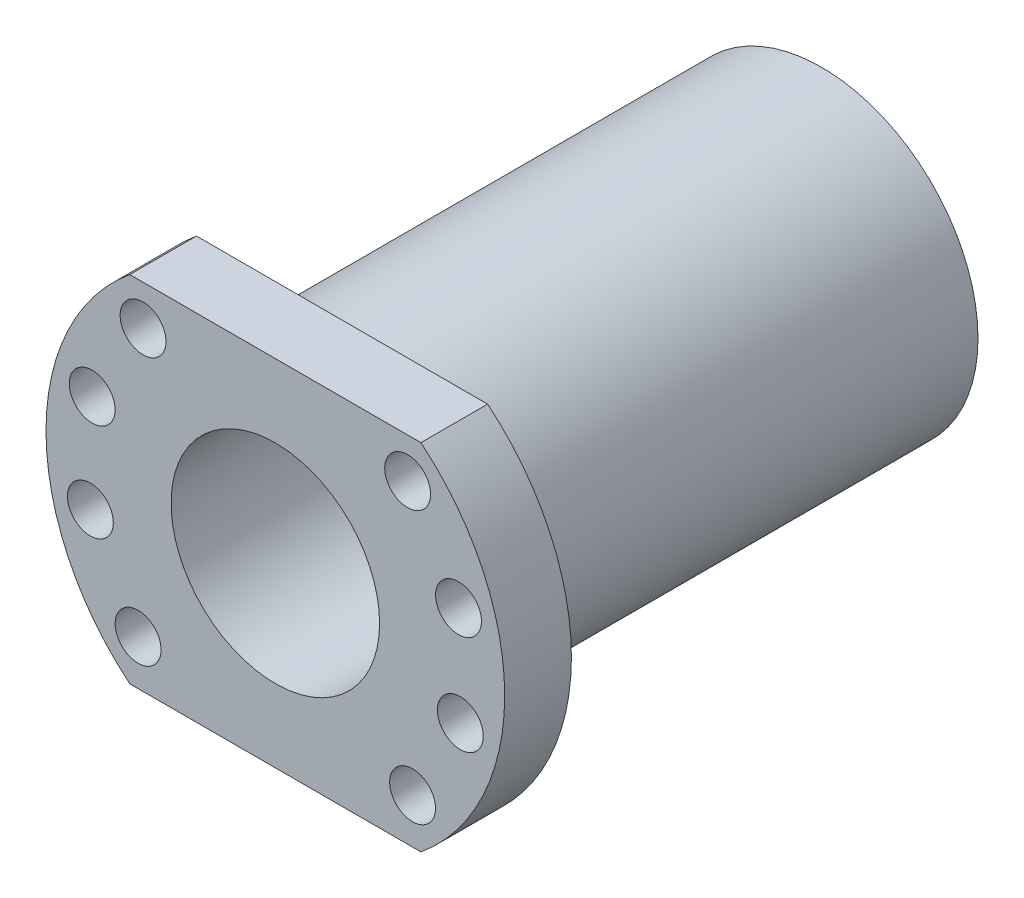
ISO-10303-21;
HEADER;
FILE_DESCRIPTION(('STEP AP214'),'2;1');
FILE_NAME('part.step','',(''),(''),'','','');
FILE_SCHEMA(('AUTOMOTIVE_DESIGN { 1 0 10303 214 1 1 1 1 }'));
ENDSEC;
DATA;
#1=APPLICATION_CONTEXT('core data for automotive mechanical design processes');
#2=APPLICATION_PROTOCOL_DEFINITION('international standard','automotive_design',2000,#1);
#3=PRODUCT_CONTEXT('',#1,'mechanical');
#4=PRODUCT('Part','Part','',(#3));
#5=PRODUCT_RELATED_PRODUCT_CATEGORY('part','',(#4));
#6=PRODUCT_DEFINITION_FORMATION('','',#4);
#7=PRODUCT_DEFINITION_CONTEXT('part definition',#1,'design');
#8=PRODUCT_DEFINITION('design','',#6,#7);
#9=PRODUCT_DEFINITION_SHAPE('','',#8);
#10=(LENGTH_UNIT() NAMED_UNIT(*) SI_UNIT(.MILLI.,.METRE.));
#11=(NAMED_UNIT(*) PLANE_ANGLE_UNIT() SI_UNIT($,.RADIAN.));
#12=(NAMED_UNIT(*) SI_UNIT($,.STERADIAN.) SOLID_ANGLE_UNIT());
#13=UNCERTAINTY_MEASURE_WITH_UNIT(LENGTH_MEASURE(1.E-05),#10,'distance_accuracy_value','');
#14=(GEOMETRIC_REPRESENTATION_CONTEXT(3) GLOBAL_UNCERTAINTY_ASSIGNED_CONTEXT((#13)) GLOBAL_UNIT_ASSIGNED_CONTEXT((#10,
#11,#12)) REPRESENTATION_CONTEXT('',''));
#15=CARTESIAN_POINT('',(0.,0.,0.));
#16=DIRECTION('',(0.,0.,1.));
#17=DIRECTION('',(1.,0.,0.));
#18=AXIS2_PLACEMENT_3D('',#15,#16,#17);
#19=CARTESIAN_POINT('',(0.,0.,16.));
#20=DIRECTION('',(0.,0.,1.));
#21=DIRECTION('',(1.,0.,0.));
#22=AXIS2_PLACEMENT_3D('',#19,#20,#21);
#23=PLANE('',#22);
#24=CARTESIAN_POINT('',(-43.9277651760763,12.6372987551193,16.));
#25=DIRECTION('',(0.,0.,1.));
#26=DIRECTION('',(1.,0.,0.));
#27=AXIS2_PLACEMENT_3D('',#24,#25,#26);
#28=CIRCLE('',#27,5.4999999999994);
#29=CARTESIAN_POINT('',(-38.4277651760769,12.6372987551193,16.));
#30=VERTEX_POINT('',#29);
#31=EDGE_CURVE('E345',#30,#30,#28,.T.);
#32=ORIENTED_EDGE('',*,*,#31,.F.);
#33=EDGE_LOOP('',(#32));
#34=FACE_BOUND('',#33,.T.);
#35=CARTESIAN_POINT('',(-44.361209951518,-11.0196608308918,16.));
#36=DIRECTION('',(0.,0.,1.));
#37=DIRECTION('',(1.,0.,0.));
#38=AXIS2_PLACEMENT_3D('',#35,#36,#37);
#39=CIRCLE('',#38,5.49999999999949);
#40=CARTESIAN_POINT('',(-38.8612099515186,-11.0196608308918,16.));
#41=VERTEX_POINT('',#40);
#42=EDGE_CURVE('E352',#41,#41,#39,.T.);
#43=ORIENTED_EDGE('',*,*,#42,.F.);
#44=EDGE_LOOP('',(#43));
#45=FACE_BOUND('',#44,.T.);
#46=CARTESIAN_POINT('',(-32.9081043451829,-31.7239111964001,16.));
#47=DIRECTION('',(0.,0.,1.));
#48=DIRECTION('',(1.,0.,0.));
#49=AXIS2_PLACEMENT_3D('',#46,#47,#48);
#50=CIRCLE('',#49,5.50000000000016);
#51=CARTESIAN_POINT('',(-27.4081043451827,-31.7239111964001,16.));
#52=VERTEX_POINT('',#51);
#53=EDGE_CURVE('E358',#52,#52,#50,.T.);
#54=ORIENTED_EDGE('',*,*,#53,.F.);
#55=EDGE_LOOP('',(#54));
#56=FACE_BOUND('',#55,.T.);
#57=CARTESIAN_POINT('',(32.9081043451829,-31.7239111964001,16.));
#58=DIRECTION('',(0.,0.,1.));
#59=DIRECTION('',(-1.,0.,0.));
#60=AXIS2_PLACEMENT_3D('',#57,#58,#59);
#61=CIRCLE('',#60,5.50000000000016);
#62=CARTESIAN_POINT('',(27.4081043451827,-31.7239111964001,16.));
#63=VERTEX_POINT('',#62);
#64=EDGE_CURVE('E364',#63,#63,#61,.T.);
#65=ORIENTED_EDGE('',*,*,#64,.F.);
#66=EDGE_LOOP('',(#65));
#67=FACE_BOUND('',#66,.T.);
#68=CARTESIAN_POINT('',(44.361209951518,-11.0196608308918,16.));
#69=DIRECTION('',(0.,0.,1.));
#70=DIRECTION('',(-1.,0.,0.));
#71=AXIS2_PLACEMENT_3D('',#68,#69,#70);
#72=CIRCLE('',#71,5.49999999999949);
#73=CARTESIAN_POINT('',(38.8612099515186,-11.0196608308918,16.));
#74=VERTEX_POINT('',#73);
#75=EDGE_CURVE('E330',#74,#74,#72,.T.);
#76=ORIENTED_EDGE('',*,*,#75,.F.);
#77=EDGE_LOOP('',(#76));
#78=FACE_BOUND('',#77,.T.);
#79=CARTESIAN_POINT('',(43.9277651760763,12.6372987551193,16.));
#80=DIRECTION('',(0.,0.,1.));
#81=DIRECTION('',(-1.,0.,0.));
#82=AXIS2_PLACEMENT_3D('',#79,#80,#81);
#83=CIRCLE('',#82,5.4999999999994);
#84=CARTESIAN_POINT('',(38.4277651760769,12.6372987551193,16.));
#85=VERTEX_POINT('',#84);
#86=EDGE_CURVE('E337',#85,#85,#83,.T.);
#87=ORIENTED_EDGE('',*,*,#86,.F.);
#88=EDGE_LOOP('',(#87));
#89=FACE_BOUND('',#88,.T.);
#90=CARTESIAN_POINT('',(31.7239111964007,32.9081043451858,16.));
#91=DIRECTION('',(0.,0.,1.));
#92=DIRECTION('',(-1.,0.,0.));
#93=AXIS2_PLACEMENT_3D('',#90,#91,#92);
#94=CIRCLE('',#93,5.5);
#95=CARTESIAN_POINT('',(26.2239111964007,32.9081043451858,16.));
#96=VERTEX_POINT('',#95);
#97=EDGE_CURVE('E326',#96,#96,#94,.T.);
#98=ORIENTED_EDGE('',*,*,#97,.F.);
#99=EDGE_LOOP('',(#98));
#100=FACE_BOUND('',#99,.T.);
#101=CARTESIAN_POINT('',(-31.7239111964007,32.9081043451858,16.));
#102=DIRECTION('',(0.,0.,1.));
#103=DIRECTION('',(1.,0.,0.));
#104=AXIS2_PLACEMENT_3D('',#101,#102,#103);
#105=CIRCLE('',#104,5.5);
#106=CARTESIAN_POINT('',(-26.2239111964007,32.9081043451858,16.));
#107=VERTEX_POINT('',#106);
#108=EDGE_CURVE('E348',#107,#107,#105,.T.);
#109=ORIENTED_EDGE('',*,*,#108,.F.);
#110=EDGE_LOOP('',(#109));
#111=FACE_BOUND('',#110,.T.);
#112=CARTESIAN_POINT('',(0.,0.,16.));
#113=DIRECTION('',(0.,0.,1.));
#114=DIRECTION('',(1.,0.,0.));
#115=AXIS2_PLACEMENT_3D('',#112,#113,#114);
#116=CIRCLE('',#115,55.);
#117=CARTESIAN_POINT('',(-34.9106001094224,42.5,16.));
#118=VERTEX_POINT('',#117);
#119=CARTESIAN_POINT('',(-34.9106001094224,-42.5,16.));
#120=VERTEX_POINT('',#119);
#121=EDGE_CURVE('E92',#118,#120,#116,.T.);
#122=ORIENTED_EDGE('',*,*,#121,.T.);
#123=DIRECTION('',(1.,0.,0.));
#124=VECTOR('',#123,1.);
#125=CARTESIAN_POINT('',(-34.9106001094224,-42.5,16.));
#126=LINE('',#125,#124);
#127=CARTESIAN_POINT('',(34.9106001094224,-42.5,16.));
#128=VERTEX_POINT('',#127);
#129=EDGE_CURVE('E87',#120,#128,#126,.T.);
#130=ORIENTED_EDGE('',*,*,#129,.T.);
#131=CARTESIAN_POINT('',(0.,0.,16.));
#132=DIRECTION('',(0.,0.,1.));
#133=DIRECTION('',(1.,0.,0.));
#134=AXIS2_PLACEMENT_3D('',#131,#132,#133);
#135=CIRCLE('',#134,55.);
#136=CARTESIAN_POINT('',(34.9106001094224,42.5,16.));
#137=VERTEX_POINT('',#136);
#138=EDGE_CURVE('E90',#128,#137,#135,.T.);
#139=ORIENTED_EDGE('',*,*,#138,.T.);
#140=DIRECTION('',(-1.,0.,0.));
#141=VECTOR('',#140,1.);
#142=CARTESIAN_POINT('',(-34.9106001094224,42.5,16.));
#143=LINE('',#142,#141);
#144=EDGE_CURVE('E56',#137,#118,#143,.T.);
#145=ORIENTED_EDGE('',*,*,#144,.T.);
#146=EDGE_LOOP('',(#122,#130,#139,#145));
#147=FACE_BOUND('',#146,.T.);
#148=CARTESIAN_POINT('',(0.,0.,16.));
#149=DIRECTION('',(0.,0.,1.));
#150=DIRECTION('',(1.,0.,0.));
#151=AXIS2_PLACEMENT_3D('',#148,#149,#150);
#152=CIRCLE('',#151,25.);
#153=CARTESIAN_POINT('',(25.,0.,16.));
#154=VERTEX_POINT('',#153);
#155=EDGE_CURVE('E109',#154,#154,#152,.T.);
#156=ORIENTED_EDGE('',*,*,#155,.F.);
#157=EDGE_LOOP('',(#156));
#158=FACE_BOUND('',#157,.T.);
#159=ADVANCED_FACE('F39',(#34,#45,#56,#67,#78,#89,#100,#111,#147,#158),#23,.T.);
#160=CARTESIAN_POINT('',(0.,0.,0.));
#161=DIRECTION('',(0.,0.,1.));
#162=DIRECTION('',(1.,0.,0.));
#163=AXIS2_PLACEMENT_3D('',#160,#161,#162);
#164=PLANE('',#163);
#165=CARTESIAN_POINT('',(0.,0.,0.));
#166=DIRECTION('',(0.,0.,1.));
#167=DIRECTION('',(1.,0.,0.));
#168=AXIS2_PLACEMENT_3D('',#165,#166,#167);
#169=CIRCLE('',#168,37.5);
#170=CARTESIAN_POINT('',(37.5,0.,0.));
#171=VERTEX_POINT('',#170);
#172=EDGE_CURVE('E11',#171,#171,#169,.F.);
#173=ORIENTED_EDGE('',*,*,#172,.F.);
#174=EDGE_LOOP('',(#173));
#175=FACE_BOUND('',#174,.T.);
#176=CARTESIAN_POINT('',(-43.9277651760763,12.6372987551193,0.));
#177=DIRECTION('',(0.,0.,1.));
#178=DIRECTION('',(1.,0.,0.));
#179=AXIS2_PLACEMENT_3D('',#176,#177,#178);
#180=CIRCLE('',#179,5.4999999999994);
#181=CARTESIAN_POINT('',(-38.4277651760769,12.6372987551193,0.));
#182=VERTEX_POINT('',#181);
#183=EDGE_CURVE('E349',#182,#182,#180,.T.);
#184=ORIENTED_EDGE('',*,*,#183,.T.);
#185=EDGE_LOOP('',(#184));
#186=FACE_BOUND('',#185,.T.);
#187=CARTESIAN_POINT('',(-44.361209951518,-11.0196608308918,0.));
#188=DIRECTION('',(0.,0.,1.));
#189=DIRECTION('',(1.,0.,0.));
#190=AXIS2_PLACEMENT_3D('',#187,#188,#189);
#191=CIRCLE('',#190,5.49999999999949);
#192=CARTESIAN_POINT('',(-38.8612099515186,-11.0196608308918,0.));
#193=VERTEX_POINT('',#192);
#194=EDGE_CURVE('E355',#193,#193,#191,.T.);
#195=ORIENTED_EDGE('',*,*,#194,.T.);
#196=EDGE_LOOP('',(#195));
#197=FACE_BOUND('',#196,.T.);
#198=CARTESIAN_POINT('',(-32.9081043451829,-31.7239111964001,0.));
#199=DIRECTION('',(0.,0.,1.));
#200=DIRECTION('',(1.,0.,0.));
#201=AXIS2_PLACEMENT_3D('',#198,#199,#200);
#202=CIRCLE('',#201,5.50000000000016);
#203=CARTESIAN_POINT('',(-27.4081043451827,-31.7239111964001,0.));
#204=VERTEX_POINT('',#203);
#205=EDGE_CURVE('E361',#204,#204,#202,.T.);
#206=ORIENTED_EDGE('',*,*,#205,.T.);
#207=EDGE_LOOP('',(#206));
#208=FACE_BOUND('',#207,.T.);
#209=CARTESIAN_POINT('',(32.9081043451829,-31.7239111964001,0.));
#210=DIRECTION('',(0.,0.,1.));
#211=DIRECTION('',(-1.,0.,0.));
#212=AXIS2_PLACEMENT_3D('',#209,#210,#211);
#213=CIRCLE('',#212,5.50000000000016);
#214=CARTESIAN_POINT('',(27.4081043451827,-31.7239111964001,0.));
#215=VERTEX_POINT('',#214);
#216=EDGE_CURVE('E333',#215,#215,#213,.T.);
#217=ORIENTED_EDGE('',*,*,#216,.T.);
#218=EDGE_LOOP('',(#217));
#219=FACE_BOUND('',#218,.T.);
#220=CARTESIAN_POINT('',(44.361209951518,-11.0196608308918,0.));
#221=DIRECTION('',(0.,0.,1.));
#222=DIRECTION('',(-1.,0.,0.));
#223=AXIS2_PLACEMENT_3D('',#220,#221,#222);
#224=CIRCLE('',#223,5.49999999999949);
#225=CARTESIAN_POINT('',(38.8612099515186,-11.0196608308918,0.));
#226=VERTEX_POINT('',#225);
#227=EDGE_CURVE('E334',#226,#226,#224,.T.);
#228=ORIENTED_EDGE('',*,*,#227,.T.);
#229=EDGE_LOOP('',(#228));
#230=FACE_BOUND('',#229,.T.);
#231=CARTESIAN_POINT('',(43.9277651760763,12.6372987551193,0.));
#232=DIRECTION('',(0.,0.,1.));
#233=DIRECTION('',(-1.,0.,0.));
#234=AXIS2_PLACEMENT_3D('',#231,#232,#233);
#235=CIRCLE('',#234,5.4999999999994);
#236=CARTESIAN_POINT('',(38.4277651760769,12.6372987551193,0.));
#237=VERTEX_POINT('',#236);
#238=EDGE_CURVE('E340',#237,#237,#235,.T.);
#239=ORIENTED_EDGE('',*,*,#238,.T.);
#240=EDGE_LOOP('',(#239));
#241=FACE_BOUND('',#240,.T.);
#242=CARTESIAN_POINT('',(31.7239111964007,32.9081043451858,0.));
#243=DIRECTION('',(0.,0.,1.));
#244=DIRECTION('',(-1.,0.,0.));
#245=AXIS2_PLACEMENT_3D('',#242,#243,#244);
#246=CIRCLE('',#245,5.5);
#247=CARTESIAN_POINT('',(26.2239111964007,32.9081043451858,0.));
#248=VERTEX_POINT('',#247);
#249=EDGE_CURVE('E323',#248,#248,#246,.T.);
#250=ORIENTED_EDGE('',*,*,#249,.T.);
#251=EDGE_LOOP('',(#250));
#252=FACE_BOUND('',#251,.T.);
#253=CARTESIAN_POINT('',(-31.7239111964007,32.9081043451858,0.));
#254=DIRECTION('',(0.,0.,1.));
#255=DIRECTION('',(1.,0.,0.));
#256=AXIS2_PLACEMENT_3D('',#253,#254,#255);
#257=CIRCLE('',#256,5.5);
#258=CARTESIAN_POINT('',(-26.2239111964007,32.9081043451858,0.));
#259=VERTEX_POINT('',#258);
#260=EDGE_CURVE('E369',#259,#259,#257,.T.);
#261=ORIENTED_EDGE('',*,*,#260,.T.);
#262=EDGE_LOOP('',(#261));
#263=FACE_BOUND('',#262,.T.);
#264=CARTESIAN_POINT('',(0.,0.,0.));
#265=DIRECTION('',(0.,0.,1.));
#266=DIRECTION('',(1.,0.,0.));
#267=AXIS2_PLACEMENT_3D('',#264,#265,#266);
#268=CIRCLE('',#267,55.);
#269=CARTESIAN_POINT('',(-34.9106001094224,42.5,0.));
#270=VERTEX_POINT('',#269);
#271=CARTESIAN_POINT('',(-34.9106001094224,-42.5,0.));
#272=VERTEX_POINT('',#271);
#273=EDGE_CURVE('E106',#270,#272,#268,.T.);
#274=ORIENTED_EDGE('',*,*,#273,.F.);
#275=DIRECTION('',(-1.,0.,0.));
#276=VECTOR('',#275,1.);
#277=CARTESIAN_POINT('',(-34.9106001094224,42.5,0.));
#278=LINE('',#277,#276);
#279=CARTESIAN_POINT('',(34.9106001094224,42.5,0.));
#280=VERTEX_POINT('',#279);
#281=EDGE_CURVE('E79',#280,#270,#278,.T.);
#282=ORIENTED_EDGE('',*,*,#281,.F.);
#283=CARTESIAN_POINT('',(0.,0.,0.));
#284=DIRECTION('',(0.,0.,1.));
#285=DIRECTION('',(1.,0.,0.));
#286=AXIS2_PLACEMENT_3D('',#283,#284,#285);
#287=CIRCLE('',#286,55.);
#288=CARTESIAN_POINT('',(34.9106001094224,-42.5,0.));
#289=VERTEX_POINT('',#288);
#290=EDGE_CURVE('E73',#289,#280,#287,.T.);
#291=ORIENTED_EDGE('',*,*,#290,.F.);
#292=DIRECTION('',(1.,0.,0.));
#293=VECTOR('',#292,1.);
#294=CARTESIAN_POINT('',(-34.9106001094224,-42.5,0.));
#295=LINE('',#294,#293);
#296=EDGE_CURVE('E97',#272,#289,#295,.T.);
#297=ORIENTED_EDGE('',*,*,#296,.F.);
#298=EDGE_LOOP('',(#274,#282,#291,#297));
#299=FACE_BOUND('',#298,.T.);
#300=ADVANCED_FACE('F117',(#175,#186,#197,#208,#219,#230,#241,#252,#263,#299),#164,.F.);
#301=CARTESIAN_POINT('',(0.,0.,16.));
#302=DIRECTION('',(0.,0.,-1.));
#303=DIRECTION('',(-1.,0.,0.));
#304=AXIS2_PLACEMENT_3D('',#301,#302,#303);
#305=CYLINDRICAL_SURFACE('',#304,55.);
#306=ORIENTED_EDGE('',*,*,#273,.T.);
#307=DIRECTION('',(0.,0.,-1.));
#308=VECTOR('',#307,1.);
#309=CARTESIAN_POINT('',(-34.9106001094224,-42.5,16.));
#310=LINE('',#309,#308);
#311=EDGE_CURVE('E48',#120,#272,#310,.T.);
#312=ORIENTED_EDGE('',*,*,#311,.F.);
#313=ORIENTED_EDGE('',*,*,#121,.F.);
#314=DIRECTION('',(0.,0.,-1.));
#315=VECTOR('',#314,1.);
#316=CARTESIAN_POINT('',(-34.9106001094224,42.5,16.));
#317=LINE('',#316,#315);
#318=EDGE_CURVE('E102',#118,#270,#317,.T.);
#319=ORIENTED_EDGE('',*,*,#318,.T.);
#320=EDGE_LOOP('',(#306,#312,#313,#319));
#321=FACE_BOUND('',#320,.T.);
#322=ADVANCED_FACE('F41',(#321),#305,.T.);
#323=CARTESIAN_POINT('',(-34.9106001094224,-42.5,16.));
#324=DIRECTION('',(0.,1.,0.));
#325=DIRECTION('',(0.,0.,1.));
#326=AXIS2_PLACEMENT_3D('',#323,#324,#325);
#327=PLANE('',#326);
#328=ORIENTED_EDGE('',*,*,#296,.T.);
#329=DIRECTION('',(0.,0.,-1.));
#330=VECTOR('',#329,1.);
#331=CARTESIAN_POINT('',(34.9106001094224,-42.5,16.));
#332=LINE('',#331,#330);
#333=EDGE_CURVE('E95',#128,#289,#332,.T.);
#334=ORIENTED_EDGE('',*,*,#333,.F.);
#335=ORIENTED_EDGE('',*,*,#129,.F.);
#336=ORIENTED_EDGE('',*,*,#311,.T.);
#337=EDGE_LOOP('',(#328,#334,#335,#336));
#338=FACE_BOUND('',#337,.T.);
#339=ADVANCED_FACE('F96',(#338),#327,.F.);
#340=CARTESIAN_POINT('',(0.,0.,16.));
#341=DIRECTION('',(0.,0.,-1.));
#342=DIRECTION('',(-1.,0.,0.));
#343=AXIS2_PLACEMENT_3D('',#340,#341,#342);
#344=CYLINDRICAL_SURFACE('',#343,55.);
#345=ORIENTED_EDGE('',*,*,#290,.T.);
#346=DIRECTION('',(0.,0.,-1.));
#347=VECTOR('',#346,1.);
#348=CARTESIAN_POINT('',(34.9106001094224,42.5,16.));
#349=LINE('',#348,#347);
#350=EDGE_CURVE('E98',#137,#280,#349,.T.);
#351=ORIENTED_EDGE('',*,*,#350,.F.);
#352=ORIENTED_EDGE('',*,*,#138,.F.);
#353=ORIENTED_EDGE('',*,*,#333,.T.);
#354=EDGE_LOOP('',(#345,#351,#352,#353));
#355=FACE_BOUND('',#354,.T.);
#356=ADVANCED_FACE('F100',(#355),#344,.T.);
#357=CARTESIAN_POINT('',(-34.9106001094224,42.5,16.));
#358=DIRECTION('',(0.,-1.,0.));
#359=DIRECTION('',(0.,0.,-1.));
#360=AXIS2_PLACEMENT_3D('',#357,#358,#359);
#361=PLANE('',#360);
#362=ORIENTED_EDGE('',*,*,#281,.T.);
#363=ORIENTED_EDGE('',*,*,#318,.F.);
#364=ORIENTED_EDGE('',*,*,#144,.F.);
#365=ORIENTED_EDGE('',*,*,#350,.T.);
#366=EDGE_LOOP('',(#362,#363,#364,#365));
#367=FACE_BOUND('',#366,.T.);
#368=ADVANCED_FACE('F131',(#367),#361,.F.);
#369=CARTESIAN_POINT('',(0.,0.,16.));
#370=DIRECTION('',(0.,0.,-1.));
#371=DIRECTION('',(-1.,0.,0.));
#372=AXIS2_PLACEMENT_3D('',#369,#370,#371);
#373=CYLINDRICAL_SURFACE('',#372,25.);
#374=ORIENTED_EDGE('',*,*,#155,.T.);
#375=EDGE_LOOP('',(#374));
#376=FACE_BOUND('',#375,.T.);
#377=CARTESIAN_POINT('',(0.,0.,-115.));
#378=DIRECTION('',(0.,0.,1.));
#379=DIRECTION('',(1.,0.,0.));
#380=AXIS2_PLACEMENT_3D('',#377,#378,#379);
#381=CIRCLE('',#380,25.);
#382=CARTESIAN_POINT('',(25.,0.,-115.));
#383=VERTEX_POINT('',#382);
#384=EDGE_CURVE('E319',#383,#383,#381,.T.);
#385=ORIENTED_EDGE('',*,*,#384,.F.);
#386=EDGE_LOOP('',(#385));
#387=FACE_BOUND('',#386,.T.);
#388=ADVANCED_FACE('F134',(#376,#387),#373,.F.);
#389=CARTESIAN_POINT('',(-31.7239111964007,32.9081043451858,0.));
#390=DIRECTION('',(0.,0.,1.));
#391=DIRECTION('',(1.,0.,0.));
#392=AXIS2_PLACEMENT_3D('',#389,#390,#391);
#393=CYLINDRICAL_SURFACE('',#392,5.5);
#394=ORIENTED_EDGE('',*,*,#260,.F.);
#395=EDGE_LOOP('',(#394));
#396=FACE_BOUND('',#395,.T.);
#397=ORIENTED_EDGE('',*,*,#108,.T.);
#398=EDGE_LOOP('',(#397));
#399=FACE_BOUND('',#398,.T.);
#400=ADVANCED_FACE('F156',(#396,#399),#393,.F.);
#401=CARTESIAN_POINT('',(31.7239111964007,32.9081043451858,0.));
#402=DIRECTION('',(0.,0.,1.));
#403=DIRECTION('',(1.,0.,0.));
#404=AXIS2_PLACEMENT_3D('',#401,#402,#403);
#405=CYLINDRICAL_SURFACE('',#404,5.5);
#406=ORIENTED_EDGE('',*,*,#249,.F.);
#407=EDGE_LOOP('',(#406));
#408=FACE_BOUND('',#407,.T.);
#409=ORIENTED_EDGE('',*,*,#97,.T.);
#410=EDGE_LOOP('',(#409));
#411=FACE_BOUND('',#410,.T.);
#412=ADVANCED_FACE('F165',(#408,#411),#405,.F.);
#413=CARTESIAN_POINT('',(43.9277651760763,12.6372987551193,0.));
#414=DIRECTION('',(0.,0.,1.));
#415=DIRECTION('',(1.,0.,0.));
#416=AXIS2_PLACEMENT_3D('',#413,#414,#415);
#417=CYLINDRICAL_SURFACE('',#416,5.4999999999994);
#418=ORIENTED_EDGE('',*,*,#238,.F.);
#419=EDGE_LOOP('',(#418));
#420=FACE_BOUND('',#419,.T.);
#421=ORIENTED_EDGE('',*,*,#86,.T.);
#422=EDGE_LOOP('',(#421));
#423=FACE_BOUND('',#422,.T.);
#424=ADVANCED_FACE('F173',(#420,#423),#417,.F.);
#425=CARTESIAN_POINT('',(44.361209951518,-11.0196608308918,0.));
#426=DIRECTION('',(0.,0.,1.));
#427=DIRECTION('',(1.,0.,0.));
#428=AXIS2_PLACEMENT_3D('',#425,#426,#427);
#429=CYLINDRICAL_SURFACE('',#428,5.49999999999949);
#430=ORIENTED_EDGE('',*,*,#227,.F.);
#431=EDGE_LOOP('',(#430));
#432=FACE_BOUND('',#431,.T.);
#433=ORIENTED_EDGE('',*,*,#75,.T.);
#434=EDGE_LOOP('',(#433));
#435=FACE_BOUND('',#434,.T.);
#436=ADVANCED_FACE('F181',(#432,#435),#429,.F.);
#437=CARTESIAN_POINT('',(32.9081043451829,-31.7239111964001,0.));
#438=DIRECTION('',(0.,0.,1.));
#439=DIRECTION('',(1.,0.,0.));
#440=AXIS2_PLACEMENT_3D('',#437,#438,#439);
#441=CYLINDRICAL_SURFACE('',#440,5.50000000000016);
#442=ORIENTED_EDGE('',*,*,#216,.F.);
#443=EDGE_LOOP('',(#442));
#444=FACE_BOUND('',#443,.T.);
#445=ORIENTED_EDGE('',*,*,#64,.T.);
#446=EDGE_LOOP('',(#445));
#447=FACE_BOUND('',#446,.T.);
#448=ADVANCED_FACE('F189',(#444,#447),#441,.F.);
#449=CARTESIAN_POINT('',(-32.9081043451829,-31.7239111964001,0.));
#450=DIRECTION('',(0.,0.,1.));
#451=DIRECTION('',(1.,0.,0.));
#452=AXIS2_PLACEMENT_3D('',#449,#450,#451);
#453=CYLINDRICAL_SURFACE('',#452,5.50000000000016);
#454=ORIENTED_EDGE('',*,*,#205,.F.);
#455=EDGE_LOOP('',(#454));
#456=FACE_BOUND('',#455,.T.);
#457=ORIENTED_EDGE('',*,*,#53,.T.);
#458=EDGE_LOOP('',(#457));
#459=FACE_BOUND('',#458,.T.);
#460=ADVANCED_FACE('F197',(#456,#459),#453,.F.);
#461=CARTESIAN_POINT('',(-44.361209951518,-11.0196608308918,0.));
#462=DIRECTION('',(0.,0.,1.));
#463=DIRECTION('',(1.,0.,0.));
#464=AXIS2_PLACEMENT_3D('',#461,#462,#463);
#465=CYLINDRICAL_SURFACE('',#464,5.49999999999949);
#466=ORIENTED_EDGE('',*,*,#194,.F.);
#467=EDGE_LOOP('',(#466));
#468=FACE_BOUND('',#467,.T.);
#469=ORIENTED_EDGE('',*,*,#42,.T.);
#470=EDGE_LOOP('',(#469));
#471=FACE_BOUND('',#470,.T.);
#472=ADVANCED_FACE('F205',(#468,#471),#465,.F.);
#473=CARTESIAN_POINT('',(-43.9277651760763,12.6372987551193,0.));
#474=DIRECTION('',(0.,0.,1.));
#475=DIRECTION('',(1.,0.,0.));
#476=AXIS2_PLACEMENT_3D('',#473,#474,#475);
#477=CYLINDRICAL_SURFACE('',#476,5.4999999999994);
#478=ORIENTED_EDGE('',*,*,#183,.F.);
#479=EDGE_LOOP('',(#478));
#480=FACE_BOUND('',#479,.T.);
#481=ORIENTED_EDGE('',*,*,#31,.T.);
#482=EDGE_LOOP('',(#481));
#483=FACE_BOUND('',#482,.T.);
#484=ADVANCED_FACE('F213',(#480,#483),#477,.F.);
#485=CARTESIAN_POINT('',(0.,0.,-115.));
#486=DIRECTION('',(0.,0.,1.));
#487=DIRECTION('',(1.,0.,0.));
#488=AXIS2_PLACEMENT_3D('',#485,#486,#487);
#489=CYLINDRICAL_SURFACE('',#488,37.5);
#490=CARTESIAN_POINT('',(0.,0.,-115.));
#491=DIRECTION('',(0.,0.,-1.));
#492=DIRECTION('',(-1.,0.,0.));
#493=AXIS2_PLACEMENT_3D('',#490,#491,#492);
#494=CIRCLE('',#493,37.5);
#495=CARTESIAN_POINT('',(-37.5,0.,-115.));
#496=VERTEX_POINT('',#495);
#497=EDGE_CURVE('E322',#496,#496,#494,.T.);
#498=ORIENTED_EDGE('',*,*,#497,.F.);
#499=EDGE_LOOP('',(#498));
#500=FACE_BOUND('',#499,.T.);
#501=ORIENTED_EDGE('',*,*,#172,.T.);
#502=EDGE_LOOP('',(#501));
#503=FACE_BOUND('',#502,.T.);
#504=ADVANCED_FACE('F221',(#500,#503),#489,.T.);
#505=CARTESIAN_POINT('',(0.,0.,-115.));
#506=DIRECTION('',(0.,0.,-1.));
#507=DIRECTION('',(-1.,0.,0.));
#508=AXIS2_PLACEMENT_3D('',#505,#506,#507);
#509=PLANE('',#508);
#510=ORIENTED_EDGE('',*,*,#384,.T.);
#511=EDGE_LOOP('',(#510));
#512=FACE_BOUND('',#511,.T.);
#513=ORIENTED_EDGE('',*,*,#497,.T.);
#514=EDGE_LOOP('',(#513));
#515=FACE_BOUND('',#514,.T.);
#516=ADVANCED_FACE('F228',(#512,#515),#509,.T.);
#517=CLOSED_SHELL('',(#159,#300,#322,#339,#356,#368,#388,#400,#412,#424,#436,#448,#460,#472,
#484,#504,#516));
#518=MANIFOLD_SOLID_BREP('B2',#517);
#519=ADVANCED_BREP_SHAPE_REPRESENTATION('',(#18,#518),#14);
#520=SHAPE_DEFINITION_REPRESENTATION(#9,#519);
ENDSEC;
END-ISO-10303-21;
